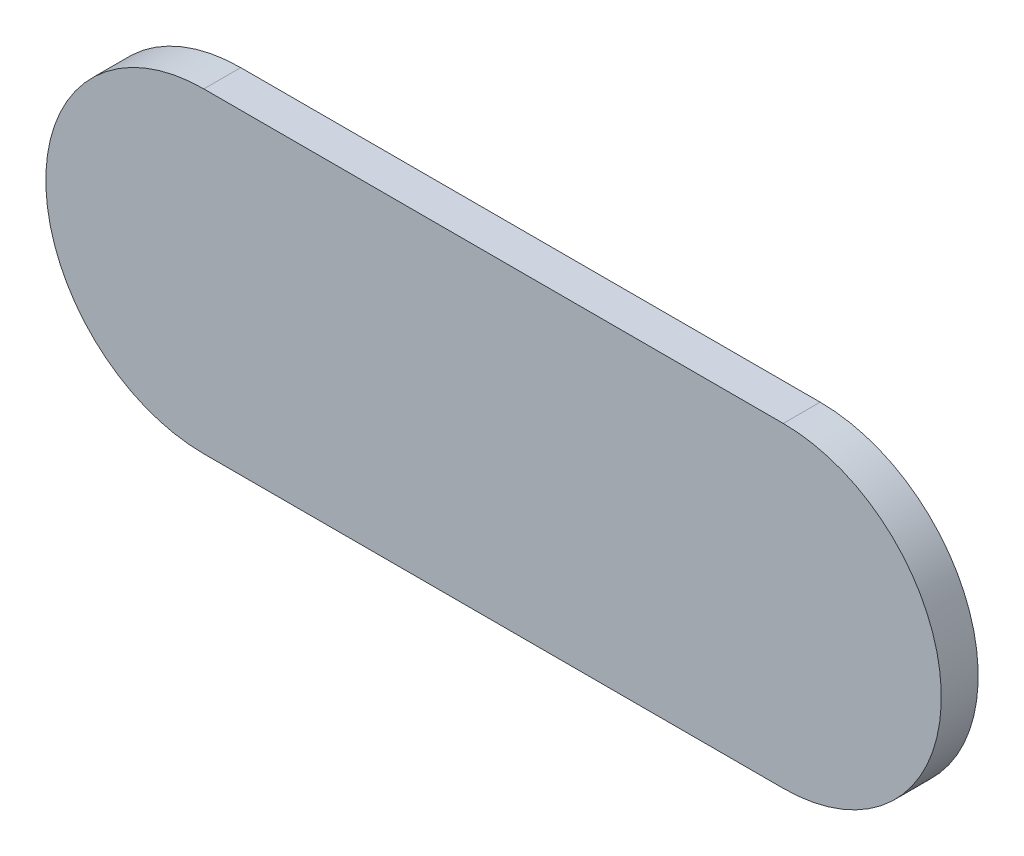
ISO-10303-21;
HEADER;
FILE_DESCRIPTION(('STEP AP214'),'2;1');
FILE_NAME('part.step','',(''),(''),'','','');
FILE_SCHEMA(('AUTOMOTIVE_DESIGN { 1 0 10303 214 1 1 1 1 }'));
ENDSEC;
DATA;
#1=APPLICATION_CONTEXT('core data for automotive mechanical design processes');
#2=APPLICATION_PROTOCOL_DEFINITION('international standard','automotive_design',2000,#1);
#3=PRODUCT_CONTEXT('',#1,'mechanical');
#4=PRODUCT('Part','Part','',(#3));
#5=PRODUCT_RELATED_PRODUCT_CATEGORY('part','',(#4));
#6=PRODUCT_DEFINITION_FORMATION('','',#4);
#7=PRODUCT_DEFINITION_CONTEXT('part definition',#1,'design');
#8=PRODUCT_DEFINITION('design','',#6,#7);
#9=PRODUCT_DEFINITION_SHAPE('','',#8);
#10=(LENGTH_UNIT() NAMED_UNIT(*) SI_UNIT(.MILLI.,.METRE.));
#11=(NAMED_UNIT(*) PLANE_ANGLE_UNIT() SI_UNIT($,.RADIAN.));
#12=(NAMED_UNIT(*) SI_UNIT($,.STERADIAN.) SOLID_ANGLE_UNIT());
#13=UNCERTAINTY_MEASURE_WITH_UNIT(LENGTH_MEASURE(1.E-05),#10,'distance_accuracy_value','');
#14=(GEOMETRIC_REPRESENTATION_CONTEXT(3) GLOBAL_UNCERTAINTY_ASSIGNED_CONTEXT((#13)) GLOBAL_UNIT_ASSIGNED_CONTEXT((#10,
#11,#12)) REPRESENTATION_CONTEXT('',''));
#15=CARTESIAN_POINT('',(0.,0.,0.));
#16=DIRECTION('',(0.,0.,1.));
#17=DIRECTION('',(1.,0.,0.));
#18=AXIS2_PLACEMENT_3D('',#15,#16,#17);
#19=CARTESIAN_POINT('',(147.05,-110.95,1.635));
#20=DIRECTION('',(0.,0.,1.));
#21=DIRECTION('',(1.,0.,0.));
#22=AXIS2_PLACEMENT_3D('',#19,#20,#21);
#23=PLANE('',#22);
#24=DIRECTION('',(-1.,0.,0.));
#25=VECTOR('',#24,1.);
#26=CARTESIAN_POINT('',(147.05,-110.95,1.635));
#27=LINE('',#26,#25);
#28=CARTESIAN_POINT('',(147.05,-110.95,1.635));
#29=VERTEX_POINT('',#28);
#30=CARTESIAN_POINT('',(146.5,-110.95,1.635));
#31=VERTEX_POINT('',#30);
#32=EDGE_CURVE('E97',#29,#31,#27,.T.);
#33=ORIENTED_EDGE('',*,*,#32,.T.);
#34=CARTESIAN_POINT('',(146.5,-111.1,1.635));
#35=DIRECTION('',(0.,0.,1.));
#36=DIRECTION('',(0.,1.,0.));
#37=AXIS2_PLACEMENT_3D('',#34,#35,#36);
#38=CIRCLE('',#37,0.15);
#39=CARTESIAN_POINT('',(146.5,-111.25,1.635));
#40=VERTEX_POINT('',#39);
#41=EDGE_CURVE('E93',#31,#40,#38,.T.);
#42=ORIENTED_EDGE('',*,*,#41,.T.);
#43=DIRECTION('',(1.,0.,0.));
#44=VECTOR('',#43,1.);
#45=CARTESIAN_POINT('',(146.5,-111.25,1.635));
#46=LINE('',#45,#44);
#47=CARTESIAN_POINT('',(147.05,-111.25,1.635));
#48=VERTEX_POINT('',#47);
#49=EDGE_CURVE('E20',#40,#48,#46,.T.);
#50=ORIENTED_EDGE('',*,*,#49,.T.);
#51=CARTESIAN_POINT('',(147.05,-111.1,1.635));
#52=DIRECTION('',(0.,0.,1.));
#53=DIRECTION('',(1.894780628694E-13,-1.,0.));
#54=AXIS2_PLACEMENT_3D('',#51,#52,#53);
#55=CIRCLE('',#54,0.15);
#56=EDGE_CURVE('E11',#48,#29,#55,.T.);
#57=ORIENTED_EDGE('',*,*,#56,.T.);
#58=EDGE_LOOP('',(#33,#42,#50,#57));
#59=FACE_BOUND('',#58,.T.);
#60=ADVANCED_FACE('F17',(#59),#23,.T.);
#61=CARTESIAN_POINT('',(147.05,-110.95,1.6));
#62=DIRECTION('',(0.,0.,1.));
#63=DIRECTION('',(1.,0.,0.));
#64=AXIS2_PLACEMENT_3D('',#61,#62,#63);
#65=PLANE('',#64);
#66=CARTESIAN_POINT('',(147.05,-111.1,1.6));
#67=DIRECTION('',(0.,0.,1.));
#68=DIRECTION('',(1.894780628694E-13,-1.,0.));
#69=AXIS2_PLACEMENT_3D('',#66,#67,#68);
#70=CIRCLE('',#69,0.15);
#71=CARTESIAN_POINT('',(147.05,-111.25,1.6));
#72=VERTEX_POINT('',#71);
#73=CARTESIAN_POINT('',(147.05,-110.95,1.6));
#74=VERTEX_POINT('',#73);
#75=EDGE_CURVE('E26',#72,#74,#70,.T.);
#76=ORIENTED_EDGE('',*,*,#75,.F.);
#77=DIRECTION('',(1.,0.,0.));
#78=VECTOR('',#77,1.);
#79=CARTESIAN_POINT('',(146.5,-111.25,1.6));
#80=LINE('',#79,#78);
#81=CARTESIAN_POINT('',(146.5,-111.25,1.6));
#82=VERTEX_POINT('',#81);
#83=EDGE_CURVE('E71',#82,#72,#80,.T.);
#84=ORIENTED_EDGE('',*,*,#83,.F.);
#85=CARTESIAN_POINT('',(146.5,-111.1,1.6));
#86=DIRECTION('',(0.,0.,1.));
#87=DIRECTION('',(0.,1.,0.));
#88=AXIS2_PLACEMENT_3D('',#85,#86,#87);
#89=CIRCLE('',#88,0.15);
#90=CARTESIAN_POINT('',(146.5,-110.95,1.6));
#91=VERTEX_POINT('',#90);
#92=EDGE_CURVE('E78',#91,#82,#89,.T.);
#93=ORIENTED_EDGE('',*,*,#92,.F.);
#94=DIRECTION('',(-1.,0.,0.));
#95=VECTOR('',#94,1.);
#96=CARTESIAN_POINT('',(147.05,-110.95,1.6));
#97=LINE('',#96,#95);
#98=EDGE_CURVE('E82',#74,#91,#97,.T.);
#99=ORIENTED_EDGE('',*,*,#98,.F.);
#100=EDGE_LOOP('',(#76,#84,#93,#99));
#101=FACE_BOUND('',#100,.T.);
#102=ADVANCED_FACE('F80',(#101),#65,.F.);
#103=CARTESIAN_POINT('',(147.05,-111.1,1.6));
#104=DIRECTION('',(0.,0.,-1.));
#105=DIRECTION('',(1.894780628694E-13,-1.,0.));
#106=AXIS2_PLACEMENT_3D('',#103,#104,#105);
#107=CYLINDRICAL_SURFACE('',#106,0.15);
#108=ORIENTED_EDGE('',*,*,#75,.T.);
#109=DIRECTION('',(0.,0.,1.));
#110=VECTOR('',#109,1.);
#111=CARTESIAN_POINT('',(147.05,-110.95,1.6));
#112=LINE('',#111,#110);
#113=EDGE_CURVE('E87',#74,#29,#112,.T.);
#114=ORIENTED_EDGE('',*,*,#113,.T.);
#115=ORIENTED_EDGE('',*,*,#56,.F.);
#116=DIRECTION('',(0.,0.,1.));
#117=VECTOR('',#116,1.);
#118=CARTESIAN_POINT('',(147.05,-111.25,1.6));
#119=LINE('',#118,#117);
#120=EDGE_CURVE('E116',#72,#48,#119,.T.);
#121=ORIENTED_EDGE('',*,*,#120,.F.);
#122=EDGE_LOOP('',(#108,#114,#115,#121));
#123=FACE_BOUND('',#122,.T.);
#124=ADVANCED_FACE('F133',(#123),#107,.T.);
#125=CARTESIAN_POINT('',(146.5,-111.25,1.6));
#126=DIRECTION('',(0.,1.,0.));
#127=DIRECTION('',(1.,0.,0.));
#128=AXIS2_PLACEMENT_3D('',#125,#126,#127);
#129=PLANE('',#128);
#130=ORIENTED_EDGE('',*,*,#83,.T.);
#131=ORIENTED_EDGE('',*,*,#120,.T.);
#132=ORIENTED_EDGE('',*,*,#49,.F.);
#133=DIRECTION('',(0.,0.,1.));
#134=VECTOR('',#133,1.);
#135=CARTESIAN_POINT('',(146.5,-111.25,1.6));
#136=LINE('',#135,#134);
#137=EDGE_CURVE('E86',#82,#40,#136,.T.);
#138=ORIENTED_EDGE('',*,*,#137,.F.);
#139=EDGE_LOOP('',(#130,#131,#132,#138));
#140=FACE_BOUND('',#139,.T.);
#141=ADVANCED_FACE('F126',(#140),#129,.F.);
#142=CARTESIAN_POINT('',(146.5,-111.1,1.6));
#143=DIRECTION('',(0.,0.,-1.));
#144=DIRECTION('',(0.,1.,0.));
#145=AXIS2_PLACEMENT_3D('',#142,#143,#144);
#146=CYLINDRICAL_SURFACE('',#145,0.15);
#147=ORIENTED_EDGE('',*,*,#92,.T.);
#148=ORIENTED_EDGE('',*,*,#137,.T.);
#149=ORIENTED_EDGE('',*,*,#41,.F.);
#150=DIRECTION('',(0.,0.,1.));
#151=VECTOR('',#150,1.);
#152=CARTESIAN_POINT('',(146.5,-110.95,1.6));
#153=LINE('',#152,#151);
#154=EDGE_CURVE('E90',#91,#31,#153,.T.);
#155=ORIENTED_EDGE('',*,*,#154,.F.);
#156=EDGE_LOOP('',(#147,#148,#149,#155));
#157=FACE_BOUND('',#156,.T.);
#158=ADVANCED_FACE('F91',(#157),#146,.T.);
#159=CARTESIAN_POINT('',(147.05,-110.95,1.6));
#160=DIRECTION('',(0.,-1.,0.));
#161=DIRECTION('',(0.,0.,-1.));
#162=AXIS2_PLACEMENT_3D('',#159,#160,#161);
#163=PLANE('',#162);
#164=ORIENTED_EDGE('',*,*,#98,.T.);
#165=ORIENTED_EDGE('',*,*,#154,.T.);
#166=ORIENTED_EDGE('',*,*,#32,.F.);
#167=ORIENTED_EDGE('',*,*,#113,.F.);
#168=EDGE_LOOP('',(#164,#165,#166,#167));
#169=FACE_BOUND('',#168,.T.);
#170=ADVANCED_FACE('F99',(#169),#163,.F.);
#171=CLOSED_SHELL('',(#60,#102,#124,#141,#158,#170));
#172=MANIFOLD_SOLID_BREP('B1',#171);
#173=ADVANCED_BREP_SHAPE_REPRESENTATION('',(#18,#172),#14);
#174=SHAPE_DEFINITION_REPRESENTATION(#9,#173);
ENDSEC;
END-ISO-10303-21;
